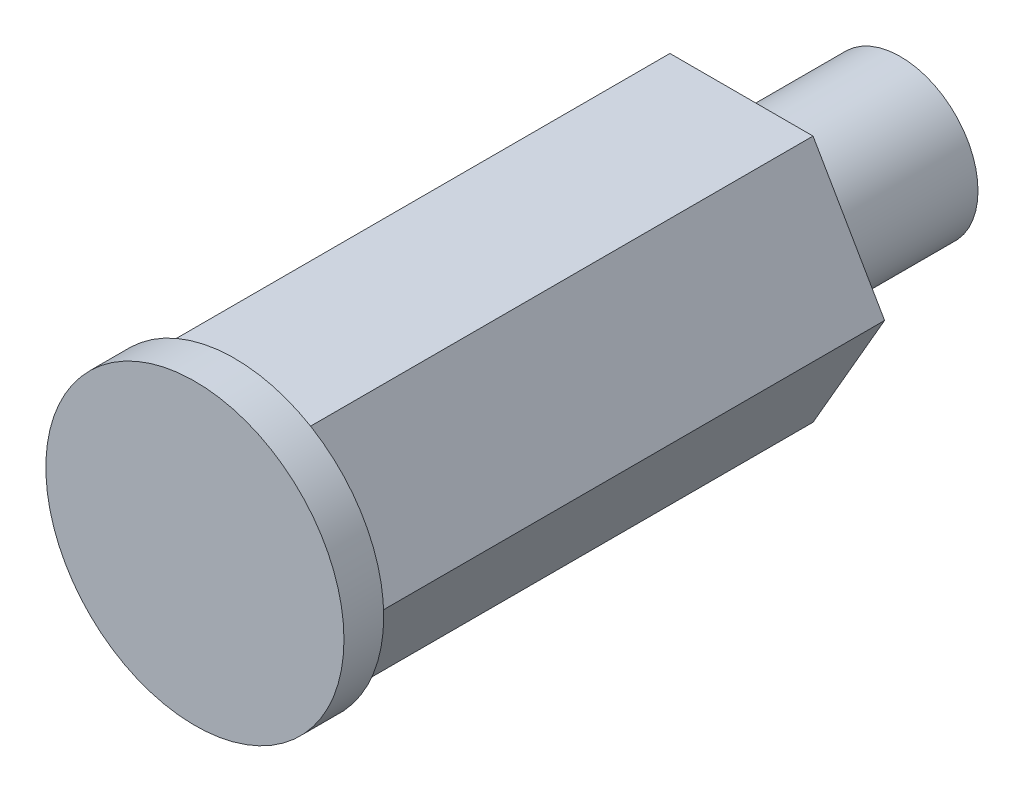
ISO-10303-21;
HEADER;
FILE_DESCRIPTION(('STEP AP214'),'2;1');
FILE_NAME('part.step','',(''),(''),'','','');
FILE_SCHEMA(('AUTOMOTIVE_DESIGN { 1 0 10303 214 1 1 1 1 }'));
ENDSEC;
DATA;
#1=APPLICATION_CONTEXT('core data for automotive mechanical design processes');
#2=APPLICATION_PROTOCOL_DEFINITION('international standard','automotive_design',2000,#1);
#3=PRODUCT_CONTEXT('',#1,'mechanical');
#4=PRODUCT('Part','Part','',(#3));
#5=PRODUCT_RELATED_PRODUCT_CATEGORY('part','',(#4));
#6=PRODUCT_DEFINITION_FORMATION('','',#4);
#7=PRODUCT_DEFINITION_CONTEXT('part definition',#1,'design');
#8=PRODUCT_DEFINITION('design','',#6,#7);
#9=PRODUCT_DEFINITION_SHAPE('','',#8);
#10=(LENGTH_UNIT() NAMED_UNIT(*) SI_UNIT(.MILLI.,.METRE.));
#11=(NAMED_UNIT(*) PLANE_ANGLE_UNIT() SI_UNIT($,.RADIAN.));
#12=(NAMED_UNIT(*) SI_UNIT($,.STERADIAN.) SOLID_ANGLE_UNIT());
#13=UNCERTAINTY_MEASURE_WITH_UNIT(LENGTH_MEASURE(1.E-05),#10,'distance_accuracy_value','');
#14=(GEOMETRIC_REPRESENTATION_CONTEXT(3) GLOBAL_UNCERTAINTY_ASSIGNED_CONTEXT((#13)) GLOBAL_UNIT_ASSIGNED_CONTEXT((#10,
#11,#12)) REPRESENTATION_CONTEXT('',''));
#15=CARTESIAN_POINT('',(0.,0.,0.));
#16=DIRECTION('',(0.,0.,1.));
#17=DIRECTION('',(1.,0.,0.));
#18=AXIS2_PLACEMENT_3D('',#15,#16,#17);
#19=CARTESIAN_POINT('',(0.,0.,0.));
#20=DIRECTION('',(0.,0.,1.));
#21=DIRECTION('',(1.,0.,0.));
#22=AXIS2_PLACEMENT_3D('',#19,#20,#21);
#23=PLANE('',#22);
#24=CARTESIAN_POINT('',(0.,0.,0.));
#25=DIRECTION('',(0.,0.,1.));
#26=DIRECTION('',(1.,0.,0.));
#27=AXIS2_PLACEMENT_3D('',#24,#25,#26);
#28=CIRCLE('',#27,3.9);
#29=CARTESIAN_POINT('',(3.9,0.,0.));
#30=VERTEX_POINT('',#29);
#31=EDGE_CURVE('E49',#30,#30,#28,.T.);
#32=ORIENTED_EDGE('',*,*,#31,.F.);
#33=EDGE_LOOP('',(#32));
#34=FACE_BOUND('',#33,.T.);
#35=CARTESIAN_POINT('',(0.,0.,0.));
#36=DIRECTION('',(0.,0.,1.));
#37=DIRECTION('',(-1.,0.,0.));
#38=AXIS2_PLACEMENT_3D('',#35,#36,#37);
#39=CIRCLE('',#38,2.9);
#40=CARTESIAN_POINT('',(2.08076908858239,2.02,0.));
#41=VERTEX_POINT('',#40);
#42=CARTESIAN_POINT('',(-2.08076908858239,2.02,0.));
#43=VERTEX_POINT('',#42);
#44=EDGE_CURVE('E69',#41,#43,#39,.T.);
#45=ORIENTED_EDGE('',*,*,#44,.T.);
#46=DIRECTION('',(0.,-1.,0.));
#47=VECTOR('',#46,1.);
#48=CARTESIAN_POINT('',(-2.08076908858239,-2.02,0.));
#49=LINE('',#48,#47);
#50=CARTESIAN_POINT('',(-2.08076908858239,-2.02,0.));
#51=VERTEX_POINT('',#50);
#52=EDGE_CURVE('E214',#43,#51,#49,.T.);
#53=ORIENTED_EDGE('',*,*,#52,.T.);
#54=CARTESIAN_POINT('',(0.,0.,0.));
#55=DIRECTION('',(0.,0.,1.));
#56=DIRECTION('',(1.,0.,0.));
#57=AXIS2_PLACEMENT_3D('',#54,#55,#56);
#58=CIRCLE('',#57,2.9);
#59=CARTESIAN_POINT('',(2.08076908858239,-2.02,0.));
#60=VERTEX_POINT('',#59);
#61=EDGE_CURVE('E218',#51,#60,#58,.T.);
#62=ORIENTED_EDGE('',*,*,#61,.T.);
#63=DIRECTION('',(0.,1.,0.));
#64=VECTOR('',#63,1.);
#65=CARTESIAN_POINT('',(2.08076908858239,-2.02,0.));
#66=LINE('',#65,#64);
#67=EDGE_CURVE('E201',#60,#41,#66,.T.);
#68=ORIENTED_EDGE('',*,*,#67,.T.);
#69=EDGE_LOOP('',(#45,#53,#62,#68));
#70=FACE_BOUND('',#69,.T.);
#71=ADVANCED_FACE('F45',(#34,#70),#23,.F.);
#72=CARTESIAN_POINT('',(0.,0.,8.));
#73=DIRECTION('',(0.,0.,-1.));
#74=DIRECTION('',(-1.,0.,0.));
#75=AXIS2_PLACEMENT_3D('',#72,#73,#74);
#76=CYLINDRICAL_SURFACE('',#75,3.9);
#77=CARTESIAN_POINT('',(0.,0.,8.));
#78=DIRECTION('',(0.,0.,1.));
#79=DIRECTION('',(1.,0.,0.));
#80=AXIS2_PLACEMENT_3D('',#77,#78,#79);
#81=CIRCLE('',#80,3.9);
#82=CARTESIAN_POINT('',(3.9,0.,8.));
#83=VERTEX_POINT('',#82);
#84=EDGE_CURVE('E11',#83,#83,#81,.T.);
#85=ORIENTED_EDGE('',*,*,#84,.F.);
#86=EDGE_LOOP('',(#85));
#87=FACE_BOUND('',#86,.T.);
#88=ORIENTED_EDGE('',*,*,#31,.T.);
#89=EDGE_LOOP('',(#88));
#90=FACE_BOUND('',#89,.T.);
#91=ADVANCED_FACE('F47',(#87,#90),#76,.T.);
#92=CARTESIAN_POINT('',(0.,0.,8.));
#93=DIRECTION('',(0.,0.,-1.));
#94=DIRECTION('',(-1.,0.,0.));
#95=AXIS2_PLACEMENT_3D('',#92,#93,#94);
#96=CYLINDRICAL_SURFACE('',#95,2.9);
#97=ORIENTED_EDGE('',*,*,#44,.F.);
#98=DIRECTION('',(0.,0.,-1.));
#99=VECTOR('',#98,1.);
#100=CARTESIAN_POINT('',(2.08076908858239,2.02,8.));
#101=LINE('',#100,#99);
#102=CARTESIAN_POINT('',(2.08076908858239,2.02,8.));
#103=VERTEX_POINT('',#102);
#104=EDGE_CURVE('E211',#103,#41,#101,.T.);
#105=ORIENTED_EDGE('',*,*,#104,.F.);
#106=CARTESIAN_POINT('',(0.,0.,8.));
#107=DIRECTION('',(0.,0.,1.));
#108=DIRECTION('',(-1.,0.,0.));
#109=AXIS2_PLACEMENT_3D('',#106,#107,#108);
#110=CIRCLE('',#109,2.9);
#111=CARTESIAN_POINT('',(-2.08076908858239,2.02,8.));
#112=VERTEX_POINT('',#111);
#113=EDGE_CURVE('E196',#103,#112,#110,.T.);
#114=ORIENTED_EDGE('',*,*,#113,.T.);
#115=DIRECTION('',(0.,0.,-1.));
#116=VECTOR('',#115,1.);
#117=CARTESIAN_POINT('',(-2.08076908858239,2.02,8.));
#118=LINE('',#117,#116);
#119=EDGE_CURVE('E233',#112,#43,#118,.T.);
#120=ORIENTED_EDGE('',*,*,#119,.T.);
#121=EDGE_LOOP('',(#97,#105,#114,#120));
#122=FACE_BOUND('',#121,.T.);
#123=ADVANCED_FACE('F247',(#122),#96,.F.);
#124=CARTESIAN_POINT('',(-2.08076908858239,-2.02,8.));
#125=DIRECTION('',(1.,0.,0.));
#126=DIRECTION('',(0.,0.,-1.));
#127=AXIS2_PLACEMENT_3D('',#124,#125,#126);
#128=PLANE('',#127);
#129=ORIENTED_EDGE('',*,*,#52,.F.);
#130=ORIENTED_EDGE('',*,*,#119,.F.);
#131=DIRECTION('',(0.,-1.,0.));
#132=VECTOR('',#131,1.);
#133=CARTESIAN_POINT('',(-2.08076908858239,-2.02,8.));
#134=LINE('',#133,#132);
#135=CARTESIAN_POINT('',(-2.08076908858239,-2.02,8.));
#136=VERTEX_POINT('',#135);
#137=EDGE_CURVE('E200',#112,#136,#134,.T.);
#138=ORIENTED_EDGE('',*,*,#137,.T.);
#139=DIRECTION('',(0.,0.,-1.));
#140=VECTOR('',#139,1.);
#141=CARTESIAN_POINT('',(-2.08076908858239,-2.02,8.));
#142=LINE('',#141,#140);
#143=EDGE_CURVE('E230',#136,#51,#142,.T.);
#144=ORIENTED_EDGE('',*,*,#143,.T.);
#145=EDGE_LOOP('',(#129,#130,#138,#144));
#146=FACE_BOUND('',#145,.T.);
#147=ADVANCED_FACE('F249',(#146),#128,.T.);
#148=CARTESIAN_POINT('',(0.,0.,8.));
#149=DIRECTION('',(0.,0.,-1.));
#150=DIRECTION('',(-1.,0.,0.));
#151=AXIS2_PLACEMENT_3D('',#148,#149,#150);
#152=CYLINDRICAL_SURFACE('',#151,2.9);
#153=ORIENTED_EDGE('',*,*,#61,.F.);
#154=ORIENTED_EDGE('',*,*,#143,.F.);
#155=CARTESIAN_POINT('',(0.,0.,8.));
#156=DIRECTION('',(0.,0.,1.));
#157=DIRECTION('',(1.,0.,0.));
#158=AXIS2_PLACEMENT_3D('',#155,#156,#157);
#159=CIRCLE('',#158,2.9);
#160=CARTESIAN_POINT('',(2.08076908858239,-2.02,8.));
#161=VERTEX_POINT('',#160);
#162=EDGE_CURVE('E205',#136,#161,#159,.T.);
#163=ORIENTED_EDGE('',*,*,#162,.T.);
#164=DIRECTION('',(0.,0.,-1.));
#165=VECTOR('',#164,1.);
#166=CARTESIAN_POINT('',(2.08076908858239,-2.02,8.));
#167=LINE('',#166,#165);
#168=EDGE_CURVE('E227',#161,#60,#167,.T.);
#169=ORIENTED_EDGE('',*,*,#168,.T.);
#170=EDGE_LOOP('',(#153,#154,#163,#169));
#171=FACE_BOUND('',#170,.T.);
#172=ADVANCED_FACE('F252',(#171),#152,.F.);
#173=CARTESIAN_POINT('',(2.08076908858239,-2.02,8.));
#174=DIRECTION('',(-1.,0.,0.));
#175=DIRECTION('',(0.,0.,1.));
#176=AXIS2_PLACEMENT_3D('',#173,#174,#175);
#177=PLANE('',#176);
#178=ORIENTED_EDGE('',*,*,#67,.F.);
#179=ORIENTED_EDGE('',*,*,#168,.F.);
#180=DIRECTION('',(0.,1.,0.));
#181=VECTOR('',#180,1.);
#182=CARTESIAN_POINT('',(2.08076908858239,-2.02,8.));
#183=LINE('',#182,#181);
#184=EDGE_CURVE('E61',#161,#103,#183,.T.);
#185=ORIENTED_EDGE('',*,*,#184,.T.);
#186=ORIENTED_EDGE('',*,*,#104,.T.);
#187=EDGE_LOOP('',(#178,#179,#185,#186));
#188=FACE_BOUND('',#187,.T.);
#189=ADVANCED_FACE('F246',(#188),#177,.T.);
#190=CARTESIAN_POINT('',(0.,0.,8.));
#191=DIRECTION('',(0.,0.,1.));
#192=DIRECTION('',(1.,0.,0.));
#193=AXIS2_PLACEMENT_3D('',#190,#191,#192);
#194=PLANE('',#193);
#195=ORIENTED_EDGE('',*,*,#137,.F.);
#196=ORIENTED_EDGE('',*,*,#113,.F.);
#197=ORIENTED_EDGE('',*,*,#184,.F.);
#198=ORIENTED_EDGE('',*,*,#162,.F.);
#199=EDGE_LOOP('',(#195,#196,#197,#198));
#200=FACE_BOUND('',#199,.T.);
#201=ADVANCED_FACE('F253',(#200),#194,.F.);
#202=CARTESIAN_POINT('',(7.2,0.,33.5));
#203=DIRECTION('',(-0.866025403784439,-0.5,0.));
#204=DIRECTION('',(0.5,-0.866025403784439,0.));
#205=AXIS2_PLACEMENT_3D('',#202,#203,#204);
#206=PLANE('',#205);
#207=DIRECTION('',(-0.5,0.866025403784439,0.));
#208=VECTOR('',#207,1.);
#209=CARTESIAN_POINT('',(7.2,0.,8.));
#210=LINE('',#209,#208);
#211=CARTESIAN_POINT('',(7.2,0.,8.));
#212=VERTEX_POINT('',#211);
#213=CARTESIAN_POINT('',(3.6,6.23538290724796,8.));
#214=VERTEX_POINT('',#213);
#215=EDGE_CURVE('E162',#212,#214,#210,.T.);
#216=ORIENTED_EDGE('',*,*,#215,.T.);
#217=DIRECTION('',(0.,0.,-1.));
#218=VECTOR('',#217,1.);
#219=CARTESIAN_POINT('',(3.6,6.23538290724796,33.5));
#220=LINE('',#219,#218);
#221=CARTESIAN_POINT('',(3.6,6.23538290724796,33.5));
#222=VERTEX_POINT('',#221);
#223=EDGE_CURVE('E133',#222,#214,#220,.T.);
#224=ORIENTED_EDGE('',*,*,#223,.F.);
#225=DIRECTION('',(-0.5,0.866025403784439,0.));
#226=VECTOR('',#225,1.);
#227=CARTESIAN_POINT('',(7.2,0.,33.5));
#228=LINE('',#227,#226);
#229=CARTESIAN_POINT('',(7.2,0.,33.5));
#230=VERTEX_POINT('',#229);
#231=EDGE_CURVE('E126',#230,#222,#228,.T.);
#232=ORIENTED_EDGE('',*,*,#231,.F.);
#233=DIRECTION('',(0.,0.,-1.));
#234=VECTOR('',#233,1.);
#235=CARTESIAN_POINT('',(7.2,0.,33.5));
#236=LINE('',#235,#234);
#237=EDGE_CURVE('E130',#230,#212,#236,.T.);
#238=ORIENTED_EDGE('',*,*,#237,.T.);
#239=EDGE_LOOP('',(#216,#224,#232,#238));
#240=FACE_BOUND('',#239,.T.);
#241=ADVANCED_FACE('F129',(#240),#206,.F.);
#242=CARTESIAN_POINT('',(3.6,6.23538290724796,33.5));
#243=DIRECTION('',(0.,-1.,0.));
#244=DIRECTION('',(1.,0.,0.));
#245=AXIS2_PLACEMENT_3D('',#242,#243,#244);
#246=PLANE('',#245);
#247=DIRECTION('',(-1.,0.,0.));
#248=VECTOR('',#247,1.);
#249=CARTESIAN_POINT('',(3.6,6.23538290724796,8.));
#250=LINE('',#249,#248);
#251=CARTESIAN_POINT('',(-3.6,6.23538290724796,8.));
#252=VERTEX_POINT('',#251);
#253=EDGE_CURVE('E165',#214,#252,#250,.T.);
#254=ORIENTED_EDGE('',*,*,#253,.T.);
#255=DIRECTION('',(0.,0.,-1.));
#256=VECTOR('',#255,1.);
#257=CARTESIAN_POINT('',(-3.6,6.23538290724796,33.5));
#258=LINE('',#257,#256);
#259=CARTESIAN_POINT('',(-3.6,6.23538290724796,33.5));
#260=VERTEX_POINT('',#259);
#261=EDGE_CURVE('E190',#260,#252,#258,.T.);
#262=ORIENTED_EDGE('',*,*,#261,.F.);
#263=DIRECTION('',(-1.,0.,0.));
#264=VECTOR('',#263,1.);
#265=CARTESIAN_POINT('',(3.6,6.23538290724796,33.5));
#266=LINE('',#265,#264);
#267=EDGE_CURVE('E138',#222,#260,#266,.T.);
#268=ORIENTED_EDGE('',*,*,#267,.F.);
#269=ORIENTED_EDGE('',*,*,#223,.T.);
#270=EDGE_LOOP('',(#254,#262,#268,#269));
#271=FACE_BOUND('',#270,.T.);
#272=ADVANCED_FACE('F262',(#271),#246,.F.);
#273=CARTESIAN_POINT('',(-3.6,6.23538290724796,33.5));
#274=DIRECTION('',(0.866025403784439,-0.5,0.));
#275=DIRECTION('',(0.5,0.866025403784439,0.));
#276=AXIS2_PLACEMENT_3D('',#273,#274,#275);
#277=PLANE('',#276);
#278=DIRECTION('',(-0.5,-0.866025403784439,0.));
#279=VECTOR('',#278,1.);
#280=CARTESIAN_POINT('',(-3.6,6.23538290724796,8.));
#281=LINE('',#280,#279);
#282=CARTESIAN_POINT('',(-7.19999999999999,0.,8.));
#283=VERTEX_POINT('',#282);
#284=EDGE_CURVE('E169',#252,#283,#281,.T.);
#285=ORIENTED_EDGE('',*,*,#284,.T.);
#286=DIRECTION('',(0.,0.,-1.));
#287=VECTOR('',#286,1.);
#288=CARTESIAN_POINT('',(-7.19999999999999,0.,33.5));
#289=LINE('',#288,#287);
#290=CARTESIAN_POINT('',(-7.19999999999999,0.,33.5));
#291=VERTEX_POINT('',#290);
#292=EDGE_CURVE('E186',#291,#283,#289,.T.);
#293=ORIENTED_EDGE('',*,*,#292,.F.);
#294=DIRECTION('',(-0.5,-0.866025403784439,0.));
#295=VECTOR('',#294,1.);
#296=CARTESIAN_POINT('',(-3.6,6.23538290724796,33.5));
#297=LINE('',#296,#295);
#298=EDGE_CURVE('E285',#260,#291,#297,.T.);
#299=ORIENTED_EDGE('',*,*,#298,.F.);
#300=ORIENTED_EDGE('',*,*,#261,.T.);
#301=EDGE_LOOP('',(#285,#293,#299,#300));
#302=FACE_BOUND('',#301,.T.);
#303=ADVANCED_FACE('F300',(#302),#277,.F.);
#304=CARTESIAN_POINT('',(-7.19999999999999,0.,33.5));
#305=DIRECTION('',(0.866025403784438,0.5,0.));
#306=DIRECTION('',(-0.5,0.866025403784438,0.));
#307=AXIS2_PLACEMENT_3D('',#304,#305,#306);
#308=PLANE('',#307);
#309=DIRECTION('',(0.5,-0.866025403784438,0.));
#310=VECTOR('',#309,1.);
#311=CARTESIAN_POINT('',(-7.19999999999999,0.,8.));
#312=LINE('',#311,#310);
#313=CARTESIAN_POINT('',(-3.59999999999999,-6.23538290724796,8.));
#314=VERTEX_POINT('',#313);
#315=EDGE_CURVE('E172',#283,#314,#312,.T.);
#316=ORIENTED_EDGE('',*,*,#315,.T.);
#317=DIRECTION('',(0.,0.,-1.));
#318=VECTOR('',#317,1.);
#319=CARTESIAN_POINT('',(-3.59999999999999,-6.23538290724796,33.5));
#320=LINE('',#319,#318);
#321=CARTESIAN_POINT('',(-3.59999999999999,-6.23538290724796,33.5));
#322=VERTEX_POINT('',#321);
#323=EDGE_CURVE('E182',#322,#314,#320,.T.);
#324=ORIENTED_EDGE('',*,*,#323,.F.);
#325=DIRECTION('',(0.5,-0.866025403784438,0.));
#326=VECTOR('',#325,1.);
#327=CARTESIAN_POINT('',(-7.19999999999999,0.,33.5));
#328=LINE('',#327,#326);
#329=EDGE_CURVE('E158',#291,#322,#328,.T.);
#330=ORIENTED_EDGE('',*,*,#329,.F.);
#331=ORIENTED_EDGE('',*,*,#292,.T.);
#332=EDGE_LOOP('',(#316,#324,#330,#331));
#333=FACE_BOUND('',#332,.T.);
#334=ADVANCED_FACE('F293',(#333),#308,.F.);
#335=CARTESIAN_POINT('',(-3.59999999999999,-6.23538290724796,33.5));
#336=DIRECTION('',(0.,1.,0.));
#337=DIRECTION('',(0.,0.,1.));
#338=AXIS2_PLACEMENT_3D('',#335,#336,#337);
#339=PLANE('',#338);
#340=DIRECTION('',(1.,0.,0.));
#341=VECTOR('',#340,1.);
#342=CARTESIAN_POINT('',(-3.59999999999999,-6.23538290724796,8.));
#343=LINE('',#342,#341);
#344=CARTESIAN_POINT('',(3.6,-6.23538290724796,8.));
#345=VERTEX_POINT('',#344);
#346=EDGE_CURVE('E175',#314,#345,#343,.T.);
#347=ORIENTED_EDGE('',*,*,#346,.T.);
#348=DIRECTION('',(0.,0.,-1.));
#349=VECTOR('',#348,1.);
#350=CARTESIAN_POINT('',(3.6,-6.23538290724796,33.5));
#351=LINE('',#350,#349);
#352=CARTESIAN_POINT('',(3.6,-6.23538290724796,33.5));
#353=VERTEX_POINT('',#352);
#354=EDGE_CURVE('E149',#353,#345,#351,.T.);
#355=ORIENTED_EDGE('',*,*,#354,.F.);
#356=DIRECTION('',(1.,0.,0.));
#357=VECTOR('',#356,1.);
#358=CARTESIAN_POINT('',(-3.59999999999999,-6.23538290724796,33.5));
#359=LINE('',#358,#357);
#360=EDGE_CURVE('E154',#322,#353,#359,.T.);
#361=ORIENTED_EDGE('',*,*,#360,.F.);
#362=ORIENTED_EDGE('',*,*,#323,.T.);
#363=EDGE_LOOP('',(#347,#355,#361,#362));
#364=FACE_BOUND('',#363,.T.);
#365=ADVANCED_FACE('F275',(#364),#339,.F.);
#366=CARTESIAN_POINT('',(3.6,-6.23538290724796,33.5));
#367=DIRECTION('',(-0.866025403784439,0.5,0.));
#368=DIRECTION('',(-0.5,-0.866025403784439,0.));
#369=AXIS2_PLACEMENT_3D('',#366,#367,#368);
#370=PLANE('',#369);
#371=DIRECTION('',(0.5,0.866025403784439,0.));
#372=VECTOR('',#371,1.);
#373=CARTESIAN_POINT('',(3.6,-6.23538290724796,8.));
#374=LINE('',#373,#372);
#375=EDGE_CURVE('E139',#345,#212,#374,.T.);
#376=ORIENTED_EDGE('',*,*,#375,.T.);
#377=ORIENTED_EDGE('',*,*,#237,.F.);
#378=DIRECTION('',(0.5,0.866025403784439,0.));
#379=VECTOR('',#378,1.);
#380=CARTESIAN_POINT('',(3.6,-6.23538290724796,33.5));
#381=LINE('',#380,#379);
#382=EDGE_CURVE('E145',#353,#230,#381,.T.);
#383=ORIENTED_EDGE('',*,*,#382,.F.);
#384=ORIENTED_EDGE('',*,*,#354,.T.);
#385=EDGE_LOOP('',(#376,#377,#383,#384));
#386=FACE_BOUND('',#385,.T.);
#387=ADVANCED_FACE('F143',(#386),#370,.F.);
#388=ORIENTED_EDGE('',*,*,#84,.T.);
#389=EDGE_LOOP('',(#388));
#390=FACE_BOUND('',#389,.T.);
#391=ORIENTED_EDGE('',*,*,#215,.F.);
#392=ORIENTED_EDGE('',*,*,#375,.F.);
#393=ORIENTED_EDGE('',*,*,#346,.F.);
#394=ORIENTED_EDGE('',*,*,#315,.F.);
#395=ORIENTED_EDGE('',*,*,#284,.F.);
#396=ORIENTED_EDGE('',*,*,#253,.F.);
#397=EDGE_LOOP('',(#391,#392,#393,#394,#395,#396));
#398=FACE_BOUND('',#397,.T.);
#399=ADVANCED_FACE('F256',(#390,#398),#194,.F.);
#400=CARTESIAN_POINT('',(0.,0.,33.5));
#401=DIRECTION('',(0.,0.,1.));
#402=DIRECTION('',(1.,0.,0.));
#403=AXIS2_PLACEMENT_3D('',#400,#401,#402);
#404=PLANE('',#403);
#405=CARTESIAN_POINT('',(0.,0.,33.5));
#406=DIRECTION('',(0.,0.,1.));
#407=DIRECTION('',(1.,0.,0.));
#408=AXIS2_PLACEMENT_3D('',#405,#406,#407);
#409=CIRCLE('',#408,7.5);
#410=CARTESIAN_POINT('',(7.5,0.,33.5));
#411=VERTEX_POINT('',#410);
#412=EDGE_CURVE('E413',#411,#411,#409,.T.);
#413=ORIENTED_EDGE('',*,*,#412,.F.);
#414=EDGE_LOOP('',(#413));
#415=FACE_BOUND('',#414,.T.);
#416=ORIENTED_EDGE('',*,*,#382,.T.);
#417=ORIENTED_EDGE('',*,*,#231,.T.);
#418=ORIENTED_EDGE('',*,*,#267,.T.);
#419=ORIENTED_EDGE('',*,*,#298,.T.);
#420=ORIENTED_EDGE('',*,*,#329,.T.);
#421=ORIENTED_EDGE('',*,*,#360,.T.);
#422=EDGE_LOOP('',(#416,#417,#418,#419,#420,#421));
#423=FACE_BOUND('',#422,.T.);
#424=ADVANCED_FACE('F151',(#415,#423),#404,.F.);
#425=CARTESIAN_POINT('',(0.,0.,35.5));
#426=DIRECTION('',(0.,0.,-1.));
#427=DIRECTION('',(-1.,0.,0.));
#428=AXIS2_PLACEMENT_3D('',#425,#426,#427);
#429=CYLINDRICAL_SURFACE('',#428,7.5);
#430=CARTESIAN_POINT('',(0.,0.,35.5));
#431=DIRECTION('',(0.,0.,1.));
#432=DIRECTION('',(1.,0.,0.));
#433=AXIS2_PLACEMENT_3D('',#430,#431,#432);
#434=CIRCLE('',#433,7.5);
#435=CARTESIAN_POINT('',(7.5,0.,35.5));
#436=VERTEX_POINT('',#435);
#437=EDGE_CURVE('E166',#436,#436,#434,.T.);
#438=ORIENTED_EDGE('',*,*,#437,.F.);
#439=EDGE_LOOP('',(#438));
#440=FACE_BOUND('',#439,.T.);
#441=ORIENTED_EDGE('',*,*,#412,.T.);
#442=EDGE_LOOP('',(#441));
#443=FACE_BOUND('',#442,.T.);
#444=ADVANCED_FACE('F271',(#440,#443),#429,.T.);
#445=CARTESIAN_POINT('',(0.,0.,35.5));
#446=DIRECTION('',(0.,0.,1.));
#447=DIRECTION('',(1.,0.,0.));
#448=AXIS2_PLACEMENT_3D('',#445,#446,#447);
#449=PLANE('',#448);
#450=ORIENTED_EDGE('',*,*,#437,.T.);
#451=EDGE_LOOP('',(#450));
#452=FACE_BOUND('',#451,.T.);
#453=ADVANCED_FACE('F395',(#452),#449,.T.);
#454=CLOSED_SHELL('',(#71,#91,#123,#147,#172,#189,#201,#241,#272,#303,#334,#365,#387,#399,#424,
#444,#453));
#455=MANIFOLD_SOLID_BREP('B2',#454);
#456=ADVANCED_BREP_SHAPE_REPRESENTATION('',(#18,#455),#14);
#457=SHAPE_DEFINITION_REPRESENTATION(#9,#456);
ENDSEC;
END-ISO-10303-21;
